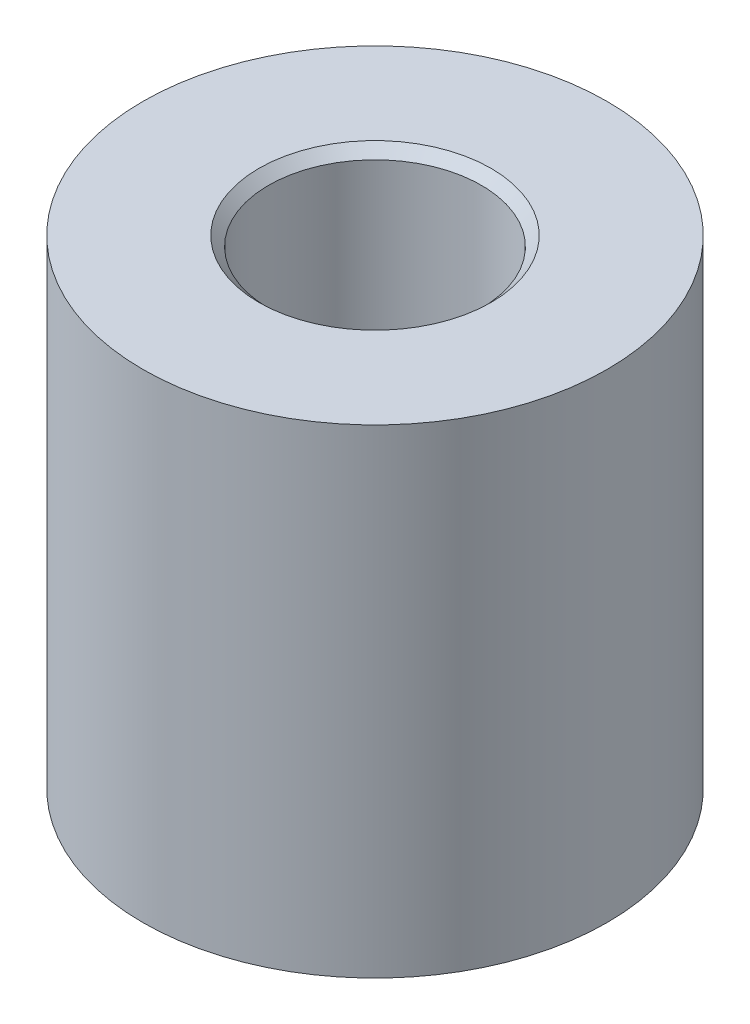
ISO-10303-21;
HEADER;
FILE_DESCRIPTION(('STEP AP214'),'2;1');
FILE_NAME('part.step','',(''),(''),'','','');
FILE_SCHEMA(('AUTOMOTIVE_DESIGN { 1 0 10303 214 1 1 1 1 }'));
ENDSEC;
DATA;
#1=APPLICATION_CONTEXT('core data for automotive mechanical design processes');
#2=APPLICATION_PROTOCOL_DEFINITION('international standard','automotive_design',2000,#1);
#3=PRODUCT_CONTEXT('',#1,'mechanical');
#4=PRODUCT('Part','Part','',(#3));
#5=PRODUCT_RELATED_PRODUCT_CATEGORY('part','',(#4));
#6=PRODUCT_DEFINITION_FORMATION('','',#4);
#7=PRODUCT_DEFINITION_CONTEXT('part definition',#1,'design');
#8=PRODUCT_DEFINITION('design','',#6,#7);
#9=PRODUCT_DEFINITION_SHAPE('','',#8);
#10=(LENGTH_UNIT() NAMED_UNIT(*) SI_UNIT(.MILLI.,.METRE.));
#11=(NAMED_UNIT(*) PLANE_ANGLE_UNIT() SI_UNIT($,.RADIAN.));
#12=(NAMED_UNIT(*) SI_UNIT($,.STERADIAN.) SOLID_ANGLE_UNIT());
#13=UNCERTAINTY_MEASURE_WITH_UNIT(LENGTH_MEASURE(1.E-05),#10,'distance_accuracy_value','');
#14=(GEOMETRIC_REPRESENTATION_CONTEXT(3) GLOBAL_UNCERTAINTY_ASSIGNED_CONTEXT((#13)) GLOBAL_UNIT_ASSIGNED_CONTEXT((#10,
#11,#12)) REPRESENTATION_CONTEXT('',''));
#15=CARTESIAN_POINT('',(0.,0.,0.));
#16=DIRECTION('',(0.,0.,1.));
#17=DIRECTION('',(1.,0.,0.));
#18=AXIS2_PLACEMENT_3D('',#15,#16,#17);
#19=CARTESIAN_POINT('',(0.,9.8290126,0.));
#20=DIRECTION('',(0.,1.,0.));
#21=DIRECTION('',(0.,0.,1.));
#22=AXIS2_PLACEMENT_3D('',#19,#20,#21);
#23=PLANE('',#22);
#24=CARTESIAN_POINT('',(0.,9.8290126,0.));
#25=DIRECTION('',(0.,1.,0.));
#26=DIRECTION('',(0.,0.,1.));
#27=AXIS2_PLACEMENT_3D('',#24,#25,#26);
#28=CIRCLE('',#27,2.3828);
#29=CARTESIAN_POINT('',(0.,9.8290126,2.3828));
#30=VERTEX_POINT('',#29);
#31=EDGE_CURVE('E10',#30,#30,#28,.F.);
#32=ORIENTED_EDGE('',*,*,#31,.T.);
#33=EDGE_LOOP('',(#32));
#34=FACE_BOUND('',#33,.T.);
#35=CARTESIAN_POINT('',(0.,9.8290126,0.));
#36=DIRECTION('',(0.,1.,0.));
#37=DIRECTION('',(0.,0.,1.));
#38=AXIS2_PLACEMENT_3D('',#35,#36,#37);
#39=CIRCLE('',#38,4.7625);
#40=CARTESIAN_POINT('',(0.,9.8290126,4.7625));
#41=VERTEX_POINT('',#40);
#42=EDGE_CURVE('E51',#41,#41,#39,.T.);
#43=ORIENTED_EDGE('',*,*,#42,.T.);
#44=EDGE_LOOP('',(#43));
#45=FACE_BOUND('',#44,.T.);
#46=ADVANCED_FACE('F31',(#34,#45),#23,.T.);
#47=CARTESIAN_POINT('',(0.,0.,0.));
#48=DIRECTION('',(0.,1.,0.));
#49=DIRECTION('',(0.,0.,1.));
#50=AXIS2_PLACEMENT_3D('',#47,#48,#49);
#51=PLANE('',#50);
#52=CARTESIAN_POINT('',(0.,0.,0.));
#53=DIRECTION('',(0.,1.,0.));
#54=DIRECTION('',(0.,0.,1.));
#55=AXIS2_PLACEMENT_3D('',#52,#53,#54);
#56=CIRCLE('',#55,2.3828);
#57=CARTESIAN_POINT('',(0.,0.,2.3828));
#58=VERTEX_POINT('',#57);
#59=EDGE_CURVE('E46',#58,#58,#56,.T.);
#60=ORIENTED_EDGE('',*,*,#59,.T.);
#61=EDGE_LOOP('',(#60));
#62=FACE_BOUND('',#61,.T.);
#63=CARTESIAN_POINT('',(0.,0.,0.));
#64=DIRECTION('',(0.,1.,0.));
#65=DIRECTION('',(0.,0.,1.));
#66=AXIS2_PLACEMENT_3D('',#63,#64,#65);
#67=CIRCLE('',#66,4.7625);
#68=CARTESIAN_POINT('',(0.,0.,4.7625));
#69=VERTEX_POINT('',#68);
#70=EDGE_CURVE('E52',#69,#69,#67,.T.);
#71=ORIENTED_EDGE('',*,*,#70,.F.);
#72=EDGE_LOOP('',(#71));
#73=FACE_BOUND('',#72,.T.);
#74=ADVANCED_FACE('F63',(#62,#73),#51,.F.);
#75=CARTESIAN_POINT('',(0.,9.8290126,0.));
#76=DIRECTION('',(0.,-1.,0.));
#77=DIRECTION('',(0.,0.,-1.));
#78=AXIS2_PLACEMENT_3D('',#75,#76,#77);
#79=CYLINDRICAL_SURFACE('',#78,4.7625);
#80=ORIENTED_EDGE('',*,*,#42,.F.);
#81=EDGE_LOOP('',(#80));
#82=FACE_BOUND('',#81,.T.);
#83=ORIENTED_EDGE('',*,*,#70,.T.);
#84=EDGE_LOOP('',(#83));
#85=FACE_BOUND('',#84,.T.);
#86=ADVANCED_FACE('F59',(#82,#85),#79,.T.);
#87=CARTESIAN_POINT('',(0.,9.8290126,0.));
#88=DIRECTION('',(0.,-1.,0.));
#89=DIRECTION('',(0.,0.,-1.));
#90=AXIS2_PLACEMENT_3D('',#87,#88,#89);
#91=CYLINDRICAL_SURFACE('',#90,2.1828);
#92=CARTESIAN_POINT('',(0.,0.199999999999999,0.));
#93=DIRECTION('',(0.,1.,0.));
#94=DIRECTION('',(0.,0.,1.));
#95=AXIS2_PLACEMENT_3D('',#92,#93,#94);
#96=CIRCLE('',#95,2.1828);
#97=CARTESIAN_POINT('',(0.,0.199999999999999,2.1828));
#98=VERTEX_POINT('',#97);
#99=EDGE_CURVE('E38',#98,#98,#96,.F.);
#100=ORIENTED_EDGE('',*,*,#99,.T.);
#101=EDGE_LOOP('',(#100));
#102=FACE_BOUND('',#101,.T.);
#103=CARTESIAN_POINT('',(0.,9.6290126,0.));
#104=DIRECTION('',(0.,1.,0.));
#105=DIRECTION('',(0.,0.,1.));
#106=AXIS2_PLACEMENT_3D('',#103,#104,#105);
#107=CIRCLE('',#106,2.1828);
#108=CARTESIAN_POINT('',(0.,9.6290126,2.1828));
#109=VERTEX_POINT('',#108);
#110=EDGE_CURVE('E42',#109,#109,#107,.T.);
#111=ORIENTED_EDGE('',*,*,#110,.T.);
#112=EDGE_LOOP('',(#111));
#113=FACE_BOUND('',#112,.T.);
#114=ADVANCED_FACE('F62',(#102,#113),#91,.F.);
#115=CARTESIAN_POINT('',(0.,0.,0.));
#116=DIRECTION('',(0.,-1.,0.));
#117=DIRECTION('',(0.,0.,-1.));
#118=AXIS2_PLACEMENT_3D('',#115,#116,#117);
#119=CONICAL_SURFACE('',#118,2.3828,0.785398163397448);
#120=ORIENTED_EDGE('',*,*,#99,.F.);
#121=EDGE_LOOP('',(#120));
#122=FACE_BOUND('',#121,.T.);
#123=ORIENTED_EDGE('',*,*,#59,.F.);
#124=EDGE_LOOP('',(#123));
#125=FACE_BOUND('',#124,.T.);
#126=ADVANCED_FACE('F76',(#122,#125),#119,.F.);
#127=CARTESIAN_POINT('',(0.,9.6290126,0.));
#128=DIRECTION('',(0.,1.,0.));
#129=DIRECTION('',(0.,0.,1.));
#130=AXIS2_PLACEMENT_3D('',#127,#128,#129);
#131=CONICAL_SURFACE('',#130,2.1828,0.785398163397448);
#132=ORIENTED_EDGE('',*,*,#31,.F.);
#133=EDGE_LOOP('',(#132));
#134=FACE_BOUND('',#133,.T.);
#135=ORIENTED_EDGE('',*,*,#110,.F.);
#136=EDGE_LOOP('',(#135));
#137=FACE_BOUND('',#136,.T.);
#138=ADVANCED_FACE('F33',(#134,#137),#131,.F.);
#139=CLOSED_SHELL('',(#46,#74,#86,#114,#126,#138));
#140=MANIFOLD_SOLID_BREP('B2',#139);
#141=ADVANCED_BREP_SHAPE_REPRESENTATION('',(#18,#140),#14);
#142=SHAPE_DEFINITION_REPRESENTATION(#9,#141);
ENDSEC;
END-ISO-10303-21;
